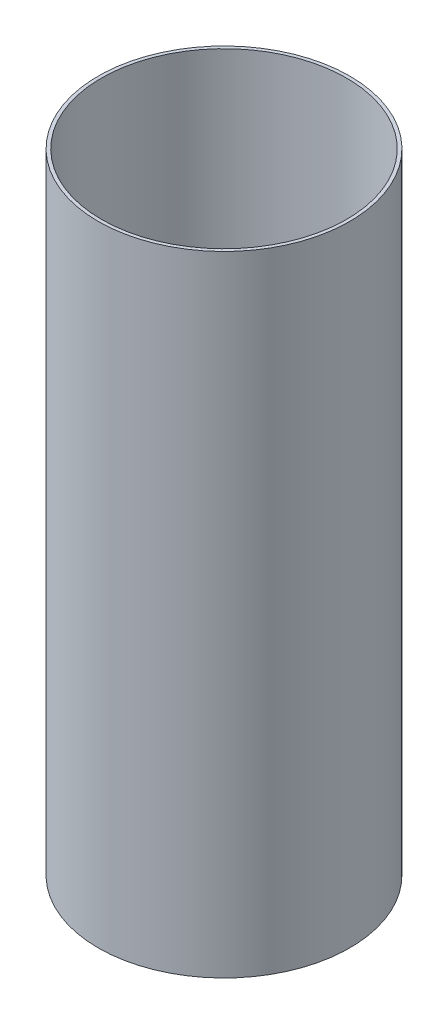
ISO-10303-21;
HEADER;
FILE_DESCRIPTION(('STEP AP214'),'2;1');
FILE_NAME('part.step','',(''),(''),'','','');
FILE_SCHEMA(('AUTOMOTIVE_DESIGN { 1 0 10303 214 1 1 1 1 }'));
ENDSEC;
DATA;
#1=APPLICATION_CONTEXT('core data for automotive mechanical design processes');
#2=APPLICATION_PROTOCOL_DEFINITION('international standard','automotive_design',2000,#1);
#3=PRODUCT_CONTEXT('',#1,'mechanical');
#4=PRODUCT('Part','Part','',(#3));
#5=PRODUCT_RELATED_PRODUCT_CATEGORY('part','',(#4));
#6=PRODUCT_DEFINITION_FORMATION('','',#4);
#7=PRODUCT_DEFINITION_CONTEXT('part definition',#1,'design');
#8=PRODUCT_DEFINITION('design','',#6,#7);
#9=PRODUCT_DEFINITION_SHAPE('','',#8);
#10=(LENGTH_UNIT() NAMED_UNIT(*) SI_UNIT(.MILLI.,.METRE.));
#11=(NAMED_UNIT(*) PLANE_ANGLE_UNIT() SI_UNIT($,.RADIAN.));
#12=(NAMED_UNIT(*) SI_UNIT($,.STERADIAN.) SOLID_ANGLE_UNIT());
#13=UNCERTAINTY_MEASURE_WITH_UNIT(LENGTH_MEASURE(1.E-05),#10,'distance_accuracy_value','');
#14=(GEOMETRIC_REPRESENTATION_CONTEXT(3) GLOBAL_UNCERTAINTY_ASSIGNED_CONTEXT((#13)) GLOBAL_UNIT_ASSIGNED_CONTEXT((#10,
#11,#12)) REPRESENTATION_CONTEXT('',''));
#15=CARTESIAN_POINT('',(0.,0.,0.));
#16=DIRECTION('',(0.,0.,1.));
#17=DIRECTION('',(1.,0.,0.));
#18=AXIS2_PLACEMENT_3D('',#15,#16,#17);
#19=CARTESIAN_POINT('',(0.,381.,0.));
#20=DIRECTION('',(0.,1.,0.));
#21=DIRECTION('',(0.,0.,1.));
#22=AXIS2_PLACEMENT_3D('',#19,#20,#21);
#23=PLANE('',#22);
#24=CARTESIAN_POINT('',(0.,381.,0.));
#25=DIRECTION('',(0.,1.,0.));
#26=DIRECTION('',(0.,0.,1.));
#27=AXIS2_PLACEMENT_3D('',#24,#25,#26);
#28=CIRCLE('',#27,76.2);
#29=CARTESIAN_POINT('',(0.,381.,76.2));
#30=VERTEX_POINT('',#29);
#31=EDGE_CURVE('E10',#30,#30,#28,.T.);
#32=ORIENTED_EDGE('',*,*,#31,.T.);
#33=EDGE_LOOP('',(#32));
#34=FACE_BOUND('',#33,.T.);
#35=CARTESIAN_POINT('',(0.,381.,0.));
#36=DIRECTION('',(0.,1.,0.));
#37=DIRECTION('',(0.,0.,1.));
#38=AXIS2_PLACEMENT_3D('',#35,#36,#37);
#39=CIRCLE('',#38,74.2);
#40=CARTESIAN_POINT('',(0.,381.,74.2));
#41=VERTEX_POINT('',#40);
#42=EDGE_CURVE('E42',#41,#41,#39,.T.);
#43=ORIENTED_EDGE('',*,*,#42,.F.);
#44=EDGE_LOOP('',(#43));
#45=FACE_BOUND('',#44,.T.);
#46=ADVANCED_FACE('F31',(#34,#45),#23,.T.);
#47=CARTESIAN_POINT('',(0.,0.,0.));
#48=DIRECTION('',(0.,1.,0.));
#49=DIRECTION('',(0.,0.,1.));
#50=AXIS2_PLACEMENT_3D('',#47,#48,#49);
#51=PLANE('',#50);
#52=CARTESIAN_POINT('',(0.,0.,0.));
#53=DIRECTION('',(0.,1.,0.));
#54=DIRECTION('',(0.,0.,1.));
#55=AXIS2_PLACEMENT_3D('',#52,#53,#54);
#56=CIRCLE('',#55,76.2);
#57=CARTESIAN_POINT('',(0.,0.,76.2));
#58=VERTEX_POINT('',#57);
#59=EDGE_CURVE('E35',#58,#58,#56,.T.);
#60=ORIENTED_EDGE('',*,*,#59,.F.);
#61=EDGE_LOOP('',(#60));
#62=FACE_BOUND('',#61,.T.);
#63=CARTESIAN_POINT('',(0.,0.,0.));
#64=DIRECTION('',(0.,1.,0.));
#65=DIRECTION('',(0.,0.,1.));
#66=AXIS2_PLACEMENT_3D('',#63,#64,#65);
#67=CIRCLE('',#66,74.2);
#68=CARTESIAN_POINT('',(0.,0.,74.2));
#69=VERTEX_POINT('',#68);
#70=EDGE_CURVE('E44',#69,#69,#67,.T.);
#71=ORIENTED_EDGE('',*,*,#70,.T.);
#72=EDGE_LOOP('',(#71));
#73=FACE_BOUND('',#72,.T.);
#74=ADVANCED_FACE('F54',(#62,#73),#51,.F.);
#75=CARTESIAN_POINT('',(0.,381.,0.));
#76=DIRECTION('',(0.,-1.,0.));
#77=DIRECTION('',(0.,0.,-1.));
#78=AXIS2_PLACEMENT_3D('',#75,#76,#77);
#79=CYLINDRICAL_SURFACE('',#78,76.2);
#80=ORIENTED_EDGE('',*,*,#31,.F.);
#81=EDGE_LOOP('',(#80));
#82=FACE_BOUND('',#81,.T.);
#83=ORIENTED_EDGE('',*,*,#59,.T.);
#84=EDGE_LOOP('',(#83));
#85=FACE_BOUND('',#84,.T.);
#86=ADVANCED_FACE('F33',(#82,#85),#79,.T.);
#87=CARTESIAN_POINT('',(0.,381.,0.));
#88=DIRECTION('',(0.,-1.,0.));
#89=DIRECTION('',(0.,0.,-1.));
#90=AXIS2_PLACEMENT_3D('',#87,#88,#89);
#91=CYLINDRICAL_SURFACE('',#90,74.2);
#92=ORIENTED_EDGE('',*,*,#42,.T.);
#93=EDGE_LOOP('',(#92));
#94=FACE_BOUND('',#93,.T.);
#95=ORIENTED_EDGE('',*,*,#70,.F.);
#96=EDGE_LOOP('',(#95));
#97=FACE_BOUND('',#96,.T.);
#98=ADVANCED_FACE('F50',(#94,#97),#91,.F.);
#99=CLOSED_SHELL('',(#46,#74,#86,#98));
#100=MANIFOLD_SOLID_BREP('B2',#99);
#101=ADVANCED_BREP_SHAPE_REPRESENTATION('',(#18,#100),#14);
#102=SHAPE_DEFINITION_REPRESENTATION(#9,#101);
ENDSEC;
END-ISO-10303-21;
